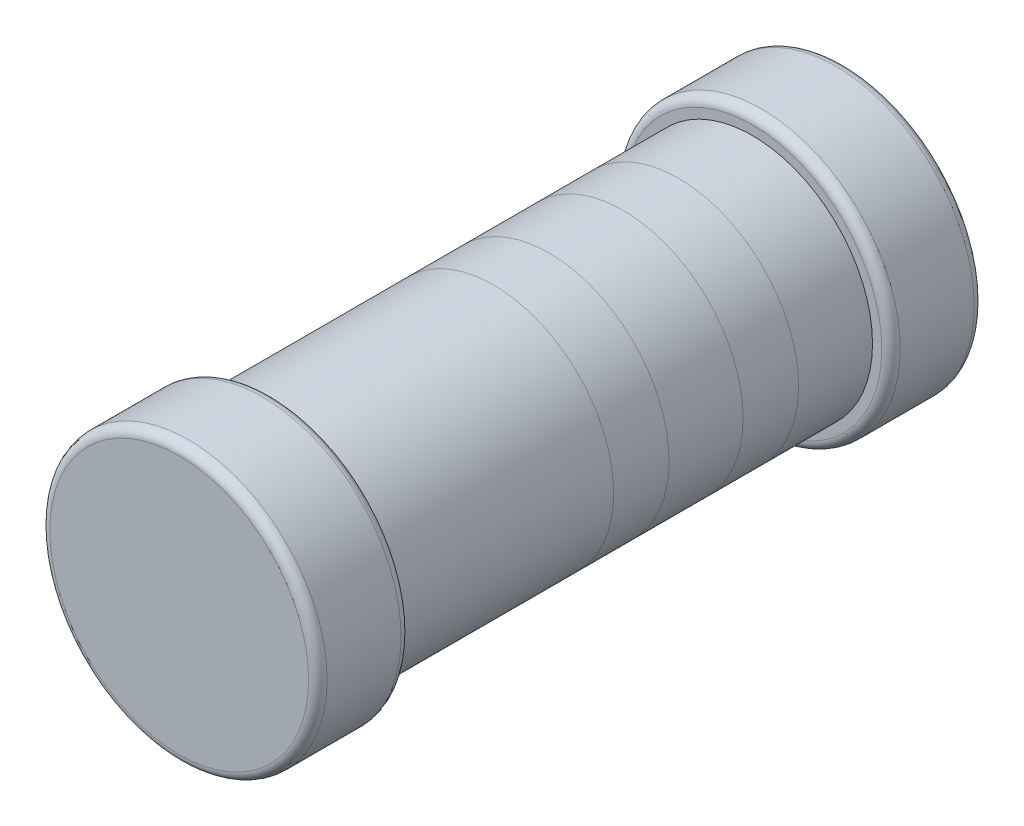
ISO-10303-21;
HEADER;
FILE_DESCRIPTION(('STEP AP214'),'2;1');
FILE_NAME('part.step','',(''),(''),'','','');
FILE_SCHEMA(('AUTOMOTIVE_DESIGN { 1 0 10303 214 1 1 1 1 }'));
ENDSEC;
DATA;
#1=APPLICATION_CONTEXT('core data for automotive mechanical design processes');
#2=APPLICATION_PROTOCOL_DEFINITION('international standard','automotive_design',2000,#1);
#3=PRODUCT_CONTEXT('',#1,'mechanical');
#4=PRODUCT('Part','Part','',(#3));
#5=PRODUCT_RELATED_PRODUCT_CATEGORY('part','',(#4));
#6=PRODUCT_DEFINITION_FORMATION('','',#4);
#7=PRODUCT_DEFINITION_CONTEXT('part definition',#1,'design');
#8=PRODUCT_DEFINITION('design','',#6,#7);
#9=PRODUCT_DEFINITION_SHAPE('','',#8);
#10=(LENGTH_UNIT() NAMED_UNIT(*) SI_UNIT(.MILLI.,.METRE.));
#11=(NAMED_UNIT(*) PLANE_ANGLE_UNIT() SI_UNIT($,.RADIAN.));
#12=(NAMED_UNIT(*) SI_UNIT($,.STERADIAN.) SOLID_ANGLE_UNIT());
#13=UNCERTAINTY_MEASURE_WITH_UNIT(LENGTH_MEASURE(1.E-05),#10,'distance_accuracy_value','');
#14=(GEOMETRIC_REPRESENTATION_CONTEXT(3) GLOBAL_UNCERTAINTY_ASSIGNED_CONTEXT((#13)) GLOBAL_UNIT_ASSIGNED_CONTEXT((#10,
#11,#12)) REPRESENTATION_CONTEXT('',''));
#15=CARTESIAN_POINT('',(0.,0.,0.));
#16=DIRECTION('',(0.,0.,1.));
#17=DIRECTION('',(1.,0.,0.));
#18=AXIS2_PLACEMENT_3D('',#15,#16,#17);
#19=CARTESIAN_POINT('',(0.,0.,-2.7));
#20=DIRECTION('',(0.,0.,-1.));
#21=DIRECTION('',(-1.,0.,0.));
#22=AXIS2_PLACEMENT_3D('',#19,#20,#21);
#23=PLANE('',#22);
#24=CARTESIAN_POINT('',(0.,0.,-2.7));
#25=DIRECTION('',(0.,0.,1.));
#26=DIRECTION('',(1.,0.,0.));
#27=AXIS2_PLACEMENT_3D('',#24,#25,#26);
#28=CIRCLE('',#27,0.65);
#29=CARTESIAN_POINT('',(0.65,0.,-2.7));
#30=VERTEX_POINT('',#29);
#31=EDGE_CURVE('P0_E18',#30,#30,#28,.F.);
#32=ORIENTED_EDGE('',*,*,#31,.F.);
#33=EDGE_LOOP('',(#32));
#34=FACE_BOUND('',#33,.T.);
#35=ADVANCED_FACE('P0_F15',(#34),#23,.F.);
#36=CARTESIAN_POINT('',(0.,0.,-7.53847763108502));
#37=DIRECTION('',(0.,0.,1.));
#38=DIRECTION('',(1.,0.,0.));
#39=AXIS2_PLACEMENT_3D('',#36,#37,#38);
#40=CYLINDRICAL_SURFACE('',#39,0.65);
#41=ORIENTED_EDGE('',*,*,#31,.T.);
#42=EDGE_LOOP('',(#41));
#43=FACE_BOUND('',#42,.T.);
#44=CARTESIAN_POINT('',(0.,0.,-3.1));
#45=DIRECTION('',(0.,0.,1.));
#46=DIRECTION('',(1.,0.,0.));
#47=AXIS2_PLACEMENT_3D('',#44,#45,#46);
#48=CIRCLE('',#47,0.65);
#49=CARTESIAN_POINT('',(0.65,0.,-3.1));
#50=VERTEX_POINT('',#49);
#51=EDGE_CURVE('P0_E10',#50,#50,#48,.T.);
#52=ORIENTED_EDGE('',*,*,#51,.T.);
#53=EDGE_LOOP('',(#52));
#54=FACE_BOUND('',#53,.T.);
#55=ADVANCED_FACE('P0_F27',(#43,#54),#40,.T.);
#56=CARTESIAN_POINT('',(0.,0.,-3.1));
#57=DIRECTION('',(0.,0.,1.));
#58=DIRECTION('',(1.,0.,0.));
#59=AXIS2_PLACEMENT_3D('',#56,#57,#58);
#60=PLANE('',#59);
#61=ORIENTED_EDGE('',*,*,#51,.F.);
#62=EDGE_LOOP('',(#61));
#63=FACE_BOUND('',#62,.T.);
#64=ADVANCED_FACE('P0_F34',(#63),#60,.F.);
#65=CLOSED_SHELL('',(#35,#55,#64));
#66=MANIFOLD_SOLID_BREP('P0_B1',#65);
#67=CARTESIAN_POINT('',(0.,0.,-2.));
#68=DIRECTION('',(0.,0.,-1.));
#69=DIRECTION('',(-1.,0.,0.));
#70=AXIS2_PLACEMENT_3D('',#67,#68,#69);
#71=PLANE('',#70);
#72=CARTESIAN_POINT('',(0.,0.,-2.));
#73=DIRECTION('',(0.,0.,1.));
#74=DIRECTION('',(1.,0.,0.));
#75=AXIS2_PLACEMENT_3D('',#72,#73,#74);
#76=CIRCLE('',#75,0.65);
#77=CARTESIAN_POINT('',(0.65,0.,-2.));
#78=VERTEX_POINT('',#77);
#79=EDGE_CURVE('P1_E18',#78,#78,#76,.F.);
#80=ORIENTED_EDGE('',*,*,#79,.F.);
#81=EDGE_LOOP('',(#80));
#82=FACE_BOUND('',#81,.T.);
#83=ADVANCED_FACE('P1_F15',(#82),#71,.F.);
#84=CARTESIAN_POINT('',(0.,0.,-2.4));
#85=DIRECTION('',(0.,0.,1.));
#86=DIRECTION('',(1.,0.,0.));
#87=AXIS2_PLACEMENT_3D('',#84,#85,#86);
#88=CYLINDRICAL_SURFACE('',#87,0.65);
#89=ORIENTED_EDGE('',*,*,#79,.T.);
#90=EDGE_LOOP('',(#89));
#91=FACE_BOUND('',#90,.T.);
#92=CARTESIAN_POINT('',(0.,0.,-2.4));
#93=DIRECTION('',(0.,0.,1.));
#94=DIRECTION('',(1.,0.,0.));
#95=AXIS2_PLACEMENT_3D('',#92,#93,#94);
#96=CIRCLE('',#95,0.65);
#97=CARTESIAN_POINT('',(0.65,0.,-2.4));
#98=VERTEX_POINT('',#97);
#99=EDGE_CURVE('P1_E10',#98,#98,#96,.F.);
#100=ORIENTED_EDGE('',*,*,#99,.F.);
#101=EDGE_LOOP('',(#100));
#102=FACE_BOUND('',#101,.T.);
#103=ADVANCED_FACE('P1_F27',(#91,#102),#88,.T.);
#104=CARTESIAN_POINT('',(0.,0.,-2.4));
#105=DIRECTION('',(0.,0.,-1.));
#106=DIRECTION('',(-1.,0.,0.));
#107=AXIS2_PLACEMENT_3D('',#104,#105,#106);
#108=PLANE('',#107);
#109=ORIENTED_EDGE('',*,*,#99,.T.);
#110=EDGE_LOOP('',(#109));
#111=FACE_BOUND('',#110,.T.);
#112=ADVANCED_FACE('P1_F35',(#111),#108,.T.);
#113=CLOSED_SHELL('',(#83,#103,#112));
#114=MANIFOLD_SOLID_BREP('P1_B1',#113);
#115=CARTESIAN_POINT('',(0.,0.,0.));
#116=DIRECTION('',(0.,0.,1.));
#117=DIRECTION('',(1.,0.,0.));
#118=AXIS2_PLACEMENT_3D('',#115,#116,#117);
#119=PLANE('',#118);
#120=CARTESIAN_POINT('',(0.,0.,0.));
#121=DIRECTION('',(0.,0.,-1.));
#122=DIRECTION('',(-1.,0.,0.));
#123=AXIS2_PLACEMENT_3D('',#120,#121,#122);
#124=CIRCLE('',#123,0.7);
#125=CARTESIAN_POINT('',(-0.7,0.,0.));
#126=VERTEX_POINT('',#125);
#127=CARTESIAN_POINT('',(0.7,0.,0.));
#128=VERTEX_POINT('',#127);
#129=EDGE_CURVE('P2_E45',#126,#128,#124,.T.);
#130=ORIENTED_EDGE('',*,*,#129,.F.);
#131=CARTESIAN_POINT('',(0.,0.,0.));
#132=DIRECTION('',(0.,0.,-1.));
#133=DIRECTION('',(1.,0.,0.));
#134=AXIS2_PLACEMENT_3D('',#131,#132,#133);
#135=CIRCLE('',#134,0.7);
#136=EDGE_CURVE('P2_E49',#128,#126,#135,.T.);
#137=ORIENTED_EDGE('',*,*,#136,.F.);
#138=EDGE_LOOP('',(#130,#137));
#139=FACE_BOUND('',#138,.T.);
#140=ADVANCED_FACE('P2_F17',(#139),#119,.T.);
#141=CARTESIAN_POINT('',(0.,0.,-0.05));
#142=DIRECTION('',(0.,0.,1.));
#143=DIRECTION('',(1.,0.,0.));
#144=AXIS2_PLACEMENT_3D('',#141,#142,#143);
#145=TOROIDAL_SURFACE('',#144,0.7,0.05);
#146=CARTESIAN_POINT('',(0.,0.,-0.05));
#147=DIRECTION('',(0.,0.,1.));
#148=DIRECTION('',(1.,0.,0.));
#149=AXIS2_PLACEMENT_3D('',#146,#147,#148);
#150=CIRCLE('',#149,0.75);
#151=CARTESIAN_POINT('',(0.75,0.,-0.05));
#152=VERTEX_POINT('',#151);
#153=EDGE_CURVE('P2_E55',#152,#152,#150,.F.);
#154=ORIENTED_EDGE('',*,*,#153,.F.);
#155=EDGE_LOOP('',(#154));
#156=FACE_BOUND('',#155,.T.);
#157=ORIENTED_EDGE('',*,*,#136,.T.);
#158=ORIENTED_EDGE('',*,*,#129,.T.);
#159=EDGE_LOOP('',(#157,#158));
#160=FACE_BOUND('',#159,.T.);
#161=ADVANCED_FACE('P2_F54',(#156,#160),#145,.T.);
#162=CARTESIAN_POINT('',(0.,0.,-0.5));
#163=DIRECTION('',(0.,0.,1.));
#164=DIRECTION('',(1.,0.,0.));
#165=AXIS2_PLACEMENT_3D('',#162,#163,#164);
#166=CYLINDRICAL_SURFACE('',#165,0.75);
#167=CARTESIAN_POINT('',(0.,0.,-0.45));
#168=DIRECTION('',(0.,0.,1.));
#169=DIRECTION('',(1.,0.,0.));
#170=AXIS2_PLACEMENT_3D('',#167,#168,#169);
#171=CIRCLE('',#170,0.75);
#172=CARTESIAN_POINT('',(0.75,0.,-0.45));
#173=VERTEX_POINT('',#172);
#174=EDGE_CURVE('P2_E78',#173,#173,#171,.F.);
#175=ORIENTED_EDGE('',*,*,#174,.F.);
#176=EDGE_LOOP('',(#175));
#177=FACE_BOUND('',#176,.T.);
#178=ORIENTED_EDGE('',*,*,#153,.T.);
#179=EDGE_LOOP('',(#178));
#180=FACE_BOUND('',#179,.T.);
#181=ADVANCED_FACE('P2_F72',(#177,#180),#166,.T.);
#182=CARTESIAN_POINT('',(0.,0.,-0.45));
#183=DIRECTION('',(0.,0.,1.));
#184=DIRECTION('',(1.,0.,0.));
#185=AXIS2_PLACEMENT_3D('',#182,#183,#184);
#186=TOROIDAL_SURFACE('',#185,0.7,0.05);
#187=CARTESIAN_POINT('',(0.,0.,-0.5));
#188=DIRECTION('',(0.,0.,1.));
#189=DIRECTION('',(1.,0.,0.));
#190=AXIS2_PLACEMENT_3D('',#187,#188,#189);
#191=CIRCLE('',#190,0.7);
#192=CARTESIAN_POINT('',(0.7,0.,-0.5));
#193=VERTEX_POINT('',#192);
#194=CARTESIAN_POINT('',(-0.7,0.,-0.5));
#195=VERTEX_POINT('',#194);
#196=EDGE_CURVE('P2_E36',#193,#195,#191,.T.);
#197=ORIENTED_EDGE('',*,*,#196,.T.);
#198=CARTESIAN_POINT('',(0.,0.,-0.5));
#199=DIRECTION('',(0.,0.,1.));
#200=DIRECTION('',(-1.,0.,0.));
#201=AXIS2_PLACEMENT_3D('',#198,#199,#200);
#202=CIRCLE('',#201,0.7);
#203=EDGE_CURVE('P2_E86',#195,#193,#202,.T.);
#204=ORIENTED_EDGE('',*,*,#203,.T.);
#205=EDGE_LOOP('',(#197,#204));
#206=FACE_BOUND('',#205,.T.);
#207=ORIENTED_EDGE('',*,*,#174,.T.);
#208=EDGE_LOOP('',(#207));
#209=FACE_BOUND('',#208,.T.);
#210=ADVANCED_FACE('P2_F94',(#206,#209),#186,.T.);
#211=CARTESIAN_POINT('',(0.,0.,-1.7));
#212=DIRECTION('',(0.,0.,-1.));
#213=DIRECTION('',(-1.,0.,0.));
#214=AXIS2_PLACEMENT_3D('',#211,#212,#213);
#215=PLANE('',#214);
#216=CARTESIAN_POINT('',(0.,0.,-1.7));
#217=DIRECTION('',(0.,0.,1.));
#218=DIRECTION('',(1.,0.,0.));
#219=AXIS2_PLACEMENT_3D('',#216,#217,#218);
#220=CIRCLE('',#219,0.65);
#221=CARTESIAN_POINT('',(0.65,0.,-1.7));
#222=VERTEX_POINT('',#221);
#223=EDGE_CURVE('P2_E28',#222,#222,#220,.T.);
#224=ORIENTED_EDGE('',*,*,#223,.F.);
#225=EDGE_LOOP('',(#224));
#226=FACE_BOUND('',#225,.T.);
#227=ADVANCED_FACE('P2_F104',(#226),#215,.T.);
#228=CARTESIAN_POINT('',(0.,0.,-0.5));
#229=DIRECTION('',(0.,0.,1.));
#230=DIRECTION('',(1.,0.,0.));
#231=AXIS2_PLACEMENT_3D('',#228,#229,#230);
#232=PLANE('',#231);
#233=CARTESIAN_POINT('',(0.,0.,-0.5));
#234=DIRECTION('',(0.,0.,1.));
#235=DIRECTION('',(1.,0.,0.));
#236=AXIS2_PLACEMENT_3D('',#233,#234,#235);
#237=CIRCLE('',#236,0.65);
#238=CARTESIAN_POINT('',(0.65,0.,-0.5));
#239=VERTEX_POINT('',#238);
#240=EDGE_CURVE('P2_E11',#239,#239,#237,.F.);
#241=ORIENTED_EDGE('',*,*,#240,.F.);
#242=EDGE_LOOP('',(#241));
#243=FACE_BOUND('',#242,.T.);
#244=ORIENTED_EDGE('',*,*,#196,.F.);
#245=ORIENTED_EDGE('',*,*,#203,.F.);
#246=EDGE_LOOP('',(#244,#245));
#247=FACE_BOUND('',#246,.T.);
#248=ADVANCED_FACE('P2_F120',(#243,#247),#232,.F.);
#249=CARTESIAN_POINT('',(0.,0.,-1.7));
#250=DIRECTION('',(0.,0.,1.));
#251=DIRECTION('',(1.,0.,0.));
#252=AXIS2_PLACEMENT_3D('',#249,#250,#251);
#253=CYLINDRICAL_SURFACE('',#252,0.65);
#254=ORIENTED_EDGE('',*,*,#223,.T.);
#255=EDGE_LOOP('',(#254));
#256=FACE_BOUND('',#255,.T.);
#257=ORIENTED_EDGE('',*,*,#240,.T.);
#258=EDGE_LOOP('',(#257));
#259=FACE_BOUND('',#258,.T.);
#260=ADVANCED_FACE('P2_F129',(#256,#259),#253,.T.);
#261=CLOSED_SHELL('',(#140,#161,#181,#210,#227,#248,#260));
#262=MANIFOLD_SOLID_BREP('P2_B1',#261);
#263=CARTESIAN_POINT('',(0.,0.,-1.7));
#264=DIRECTION('',(0.,0.,-1.));
#265=DIRECTION('',(-1.,0.,0.));
#266=AXIS2_PLACEMENT_3D('',#263,#264,#265);
#267=PLANE('',#266);
#268=CARTESIAN_POINT('',(0.,0.,-1.7));
#269=DIRECTION('',(0.,0.,1.));
#270=DIRECTION('',(1.,0.,0.));
#271=AXIS2_PLACEMENT_3D('',#268,#269,#270);
#272=CIRCLE('',#271,0.65);
#273=CARTESIAN_POINT('',(0.65,0.,-1.7));
#274=VERTEX_POINT('',#273);
#275=EDGE_CURVE('P3_E18',#274,#274,#272,.F.);
#276=ORIENTED_EDGE('',*,*,#275,.F.);
#277=EDGE_LOOP('',(#276));
#278=FACE_BOUND('',#277,.T.);
#279=ADVANCED_FACE('P3_F15',(#278),#267,.F.);
#280=CARTESIAN_POINT('',(0.,0.,-2.));
#281=DIRECTION('',(0.,0.,1.));
#282=DIRECTION('',(1.,0.,0.));
#283=AXIS2_PLACEMENT_3D('',#280,#281,#282);
#284=CYLINDRICAL_SURFACE('',#283,0.65);
#285=ORIENTED_EDGE('',*,*,#275,.T.);
#286=EDGE_LOOP('',(#285));
#287=FACE_BOUND('',#286,.T.);
#288=CARTESIAN_POINT('',(0.,0.,-2.));
#289=DIRECTION('',(0.,0.,1.));
#290=DIRECTION('',(1.,0.,0.));
#291=AXIS2_PLACEMENT_3D('',#288,#289,#290);
#292=CIRCLE('',#291,0.65);
#293=CARTESIAN_POINT('',(0.65,0.,-2.));
#294=VERTEX_POINT('',#293);
#295=EDGE_CURVE('P3_E10',#294,#294,#292,.F.);
#296=ORIENTED_EDGE('',*,*,#295,.F.);
#297=EDGE_LOOP('',(#296));
#298=FACE_BOUND('',#297,.T.);
#299=ADVANCED_FACE('P3_F27',(#287,#298),#284,.T.);
#300=CARTESIAN_POINT('',(0.,0.,-2.));
#301=DIRECTION('',(0.,0.,-1.));
#302=DIRECTION('',(-1.,0.,0.));
#303=AXIS2_PLACEMENT_3D('',#300,#301,#302);
#304=PLANE('',#303);
#305=ORIENTED_EDGE('',*,*,#295,.T.);
#306=EDGE_LOOP('',(#305));
#307=FACE_BOUND('',#306,.T.);
#308=ADVANCED_FACE('P3_F35',(#307),#304,.T.);
#309=CLOSED_SHELL('',(#279,#299,#308));
#310=MANIFOLD_SOLID_BREP('P3_B1',#309);
#311=CARTESIAN_POINT('',(0.,0.,-3.1));
#312=DIRECTION('',(0.,0.,-1.));
#313=DIRECTION('',(-1.,0.,0.));
#314=AXIS2_PLACEMENT_3D('',#311,#312,#313);
#315=PLANE('',#314);
#316=CARTESIAN_POINT('',(0.,0.,-3.1));
#317=DIRECTION('',(0.,0.,-1.));
#318=DIRECTION('',(-1.,0.,0.));
#319=AXIS2_PLACEMENT_3D('',#316,#317,#318);
#320=CIRCLE('',#319,0.7);
#321=CARTESIAN_POINT('',(-0.7,0.,-3.1));
#322=VERTEX_POINT('',#321);
#323=CARTESIAN_POINT('',(0.7,0.,-3.1));
#324=VERTEX_POINT('',#323);
#325=EDGE_CURVE('P4_E42',#322,#324,#320,.T.);
#326=ORIENTED_EDGE('',*,*,#325,.F.);
#327=CARTESIAN_POINT('',(0.,0.,-3.1));
#328=DIRECTION('',(0.,0.,-1.));
#329=DIRECTION('',(1.,0.,0.));
#330=AXIS2_PLACEMENT_3D('',#327,#328,#329);
#331=CIRCLE('',#330,0.7);
#332=EDGE_CURVE('P4_E46',#324,#322,#331,.T.);
#333=ORIENTED_EDGE('',*,*,#332,.F.);
#334=EDGE_LOOP('',(#326,#333));
#335=FACE_BOUND('',#334,.T.);
#336=ADVANCED_FACE('P4_F17',(#335),#315,.F.);
#337=CARTESIAN_POINT('',(0.,0.,-3.15));
#338=DIRECTION('',(0.,0.,-1.));
#339=DIRECTION('',(-1.,0.,0.));
#340=AXIS2_PLACEMENT_3D('',#337,#338,#339);
#341=TOROIDAL_SURFACE('',#340,0.7,0.05);
#342=ORIENTED_EDGE('',*,*,#325,.T.);
#343=ORIENTED_EDGE('',*,*,#332,.T.);
#344=EDGE_LOOP('',(#342,#343));
#345=FACE_BOUND('',#344,.T.);
#346=CARTESIAN_POINT('',(0.,0.,-3.15));
#347=DIRECTION('',(0.,0.,1.));
#348=DIRECTION('',(1.,0.,0.));
#349=AXIS2_PLACEMENT_3D('',#346,#347,#348);
#350=CIRCLE('',#349,0.75);
#351=CARTESIAN_POINT('',(0.75,0.,-3.15));
#352=VERTEX_POINT('',#351);
#353=EDGE_CURVE('P4_E53',#352,#352,#350,.F.);
#354=ORIENTED_EDGE('',*,*,#353,.F.);
#355=EDGE_LOOP('',(#354));
#356=FACE_BOUND('',#355,.T.);
#357=ADVANCED_FACE('P4_F51',(#345,#356),#341,.T.);
#358=CARTESIAN_POINT('',(0.,0.,-3.6));
#359=DIRECTION('',(0.,0.,1.));
#360=DIRECTION('',(1.,0.,0.));
#361=AXIS2_PLACEMENT_3D('',#358,#359,#360);
#362=CYLINDRICAL_SURFACE('',#361,0.75);
#363=CARTESIAN_POINT('',(0.,0.,-3.55));
#364=DIRECTION('',(0.,0.,-1.));
#365=DIRECTION('',(-1.,0.,0.));
#366=AXIS2_PLACEMENT_3D('',#363,#364,#365);
#367=CIRCLE('',#366,0.75);
#368=CARTESIAN_POINT('',(-0.75,0.,-3.55));
#369=VERTEX_POINT('',#368);
#370=EDGE_CURVE('P4_E76',#369,#369,#367,.T.);
#371=ORIENTED_EDGE('',*,*,#370,.F.);
#372=EDGE_LOOP('',(#371));
#373=FACE_BOUND('',#372,.T.);
#374=ORIENTED_EDGE('',*,*,#353,.T.);
#375=EDGE_LOOP('',(#374));
#376=FACE_BOUND('',#375,.T.);
#377=ADVANCED_FACE('P4_F71',(#373,#376),#362,.T.);
#378=CARTESIAN_POINT('',(0.,0.,-3.55));
#379=DIRECTION('',(0.,0.,-1.));
#380=DIRECTION('',(-1.,0.,0.));
#381=AXIS2_PLACEMENT_3D('',#378,#379,#380);
#382=TOROIDAL_SURFACE('',#381,0.7,0.05);
#383=ORIENTED_EDGE('',*,*,#370,.T.);
#384=EDGE_LOOP('',(#383));
#385=FACE_BOUND('',#384,.T.);
#386=CARTESIAN_POINT('',(0.,0.,-3.6));
#387=DIRECTION('',(0.,0.,1.));
#388=DIRECTION('',(-1.,0.,0.));
#389=AXIS2_PLACEMENT_3D('',#386,#387,#388);
#390=CIRCLE('',#389,0.7);
#391=CARTESIAN_POINT('',(0.7,0.,-3.6));
#392=VERTEX_POINT('',#391);
#393=CARTESIAN_POINT('',(-0.7,0.,-3.6));
#394=VERTEX_POINT('',#393);
#395=EDGE_CURVE('P4_E11',#392,#394,#390,.F.);
#396=ORIENTED_EDGE('',*,*,#395,.F.);
#397=CARTESIAN_POINT('',(0.,0.,-3.6));
#398=DIRECTION('',(0.,0.,1.));
#399=DIRECTION('',(1.,0.,0.));
#400=AXIS2_PLACEMENT_3D('',#397,#398,#399);
#401=CIRCLE('',#400,0.7);
#402=EDGE_CURVE('P4_E28',#394,#392,#401,.F.);
#403=ORIENTED_EDGE('',*,*,#402,.F.);
#404=EDGE_LOOP('',(#396,#403));
#405=FACE_BOUND('',#404,.T.);
#406=ADVANCED_FACE('P4_F100',(#385,#405),#382,.T.);
#407=CARTESIAN_POINT('',(0.,0.,-3.6));
#408=DIRECTION('',(0.,0.,-1.));
#409=DIRECTION('',(-1.,0.,0.));
#410=AXIS2_PLACEMENT_3D('',#407,#408,#409);
#411=PLANE('',#410);
#412=ORIENTED_EDGE('',*,*,#402,.T.);
#413=ORIENTED_EDGE('',*,*,#395,.T.);
#414=EDGE_LOOP('',(#412,#413));
#415=FACE_BOUND('',#414,.T.);
#416=ADVANCED_FACE('P4_F86',(#415),#411,.T.);
#417=CLOSED_SHELL('',(#336,#357,#377,#406,#416));
#418=MANIFOLD_SOLID_BREP('P4_B1',#417);
#419=CARTESIAN_POINT('',(0.,0.,-2.4));
#420=DIRECTION('',(0.,0.,-1.));
#421=DIRECTION('',(-1.,0.,0.));
#422=AXIS2_PLACEMENT_3D('',#419,#420,#421);
#423=PLANE('',#422);
#424=CARTESIAN_POINT('',(0.,0.,-2.4));
#425=DIRECTION('',(0.,0.,1.));
#426=DIRECTION('',(1.,0.,0.));
#427=AXIS2_PLACEMENT_3D('',#424,#425,#426);
#428=CIRCLE('',#427,0.65);
#429=CARTESIAN_POINT('',(0.65,0.,-2.4));
#430=VERTEX_POINT('',#429);
#431=EDGE_CURVE('P5_E18',#430,#430,#428,.F.);
#432=ORIENTED_EDGE('',*,*,#431,.F.);
#433=EDGE_LOOP('',(#432));
#434=FACE_BOUND('',#433,.T.);
#435=ADVANCED_FACE('P5_F15',(#434),#423,.F.);
#436=CARTESIAN_POINT('',(0.,0.,-2.7));
#437=DIRECTION('',(0.,0.,1.));
#438=DIRECTION('',(1.,0.,0.));
#439=AXIS2_PLACEMENT_3D('',#436,#437,#438);
#440=CYLINDRICAL_SURFACE('',#439,0.65);
#441=ORIENTED_EDGE('',*,*,#431,.T.);
#442=EDGE_LOOP('',(#441));
#443=FACE_BOUND('',#442,.T.);
#444=CARTESIAN_POINT('',(0.,0.,-2.7));
#445=DIRECTION('',(0.,0.,1.));
#446=DIRECTION('',(1.,0.,0.));
#447=AXIS2_PLACEMENT_3D('',#444,#445,#446);
#448=CIRCLE('',#447,0.65);
#449=CARTESIAN_POINT('',(0.65,0.,-2.7));
#450=VERTEX_POINT('',#449);
#451=EDGE_CURVE('P5_E10',#450,#450,#448,.F.);
#452=ORIENTED_EDGE('',*,*,#451,.F.);
#453=EDGE_LOOP('',(#452));
#454=FACE_BOUND('',#453,.T.);
#455=ADVANCED_FACE('P5_F27',(#443,#454),#440,.T.);
#456=CARTESIAN_POINT('',(0.,0.,-2.7));
#457=DIRECTION('',(0.,0.,-1.));
#458=DIRECTION('',(-1.,0.,0.));
#459=AXIS2_PLACEMENT_3D('',#456,#457,#458);
#460=PLANE('',#459);
#461=ORIENTED_EDGE('',*,*,#451,.T.);
#462=EDGE_LOOP('',(#461));
#463=FACE_BOUND('',#462,.T.);
#464=ADVANCED_FACE('P5_F35',(#463),#460,.T.);
#465=CLOSED_SHELL('',(#435,#455,#464));
#466=MANIFOLD_SOLID_BREP('P5_B1',#465);
#467=ADVANCED_BREP_SHAPE_REPRESENTATION('',(#18,#66,#114,#262,#310,#418,#466),#14);
#468=SHAPE_DEFINITION_REPRESENTATION(#9,#467);
ENDSEC;
END-ISO-10303-21;
